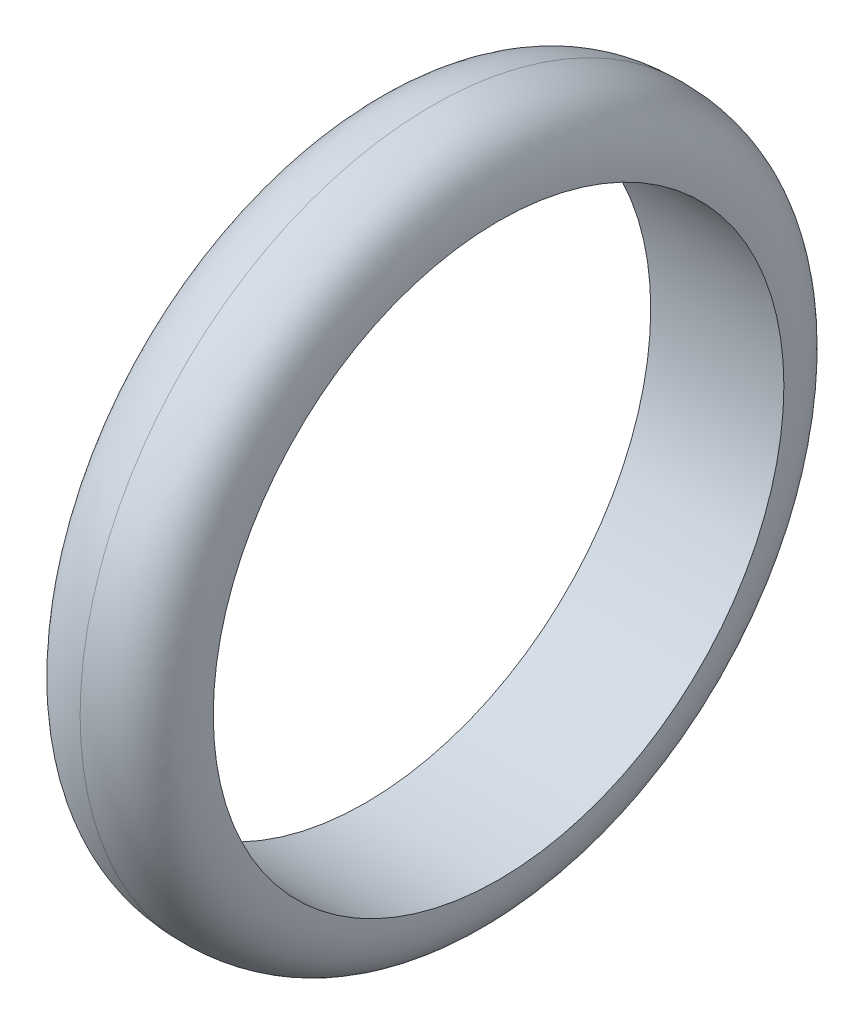
ISO-10303-21;
HEADER;
FILE_DESCRIPTION(('STEP AP214'),'2;1');
FILE_NAME('part.step','',(''),(''),'','','');
FILE_SCHEMA(('AUTOMOTIVE_DESIGN { 1 0 10303 214 1 1 1 1 }'));
ENDSEC;
DATA;
#1=APPLICATION_CONTEXT('core data for automotive mechanical design processes');
#2=APPLICATION_PROTOCOL_DEFINITION('international standard','automotive_design',2000,#1);
#3=PRODUCT_CONTEXT('',#1,'mechanical');
#4=PRODUCT('Part','Part','',(#3));
#5=PRODUCT_RELATED_PRODUCT_CATEGORY('part','',(#4));
#6=PRODUCT_DEFINITION_FORMATION('','',#4);
#7=PRODUCT_DEFINITION_CONTEXT('part definition',#1,'design');
#8=PRODUCT_DEFINITION('design','',#6,#7);
#9=PRODUCT_DEFINITION_SHAPE('','',#8);
#10=(LENGTH_UNIT() NAMED_UNIT(*) SI_UNIT(.MILLI.,.METRE.));
#11=(NAMED_UNIT(*) PLANE_ANGLE_UNIT() SI_UNIT($,.RADIAN.));
#12=(NAMED_UNIT(*) SI_UNIT($,.STERADIAN.) SOLID_ANGLE_UNIT());
#13=UNCERTAINTY_MEASURE_WITH_UNIT(LENGTH_MEASURE(1.E-05),#10,'distance_accuracy_value','');
#14=(GEOMETRIC_REPRESENTATION_CONTEXT(3) GLOBAL_UNCERTAINTY_ASSIGNED_CONTEXT((#13)) GLOBAL_UNIT_ASSIGNED_CONTEXT((#10,
#11,#12)) REPRESENTATION_CONTEXT('',''));
#15=CARTESIAN_POINT('',(0.,0.,0.));
#16=DIRECTION('',(0.,0.,1.));
#17=DIRECTION('',(1.,0.,0.));
#18=AXIS2_PLACEMENT_3D('',#15,#16,#17);
#19=CARTESIAN_POINT('',(0.,46.99,0.));
#20=CARTESIAN_POINT('',(-8.89,46.99,0.));
#21=CARTESIAN_POINT('',(-8.89,38.1,0.));
#22=B_SPLINE_CURVE_WITH_KNOTS('',2,(#19,#20,#21),.UNSPECIFIED.,.F.,.F.,(3,3),(0.,1.),.UNSPECIFIED.);
#23=CARTESIAN_POINT('',(0.,0.,0.));
#24=DIRECTION('',(-1.,0.,0.));
#25=AXIS1_PLACEMENT('',#23,#24);
#26=SURFACE_OF_REVOLUTION('',#22,#25);
#27=CARTESIAN_POINT('',(-8.89,0.,0.));
#28=DIRECTION('',(-1.,0.,0.));
#29=DIRECTION('',(0.,0.,1.));
#30=AXIS2_PLACEMENT_3D('',#27,#28,#29);
#31=CIRCLE('',#30,38.1);
#32=CARTESIAN_POINT('',(-8.89,0.,38.1));
#33=VERTEX_POINT('',#32);
#34=EDGE_CURVE('E10',#33,#33,#31,.T.);
#35=ORIENTED_EDGE('',*,*,#34,.F.);
#36=EDGE_LOOP('',(#35));
#37=FACE_BOUND('',#36,.T.);
#38=CARTESIAN_POINT('',(0.,0.,0.));
#39=DIRECTION('',(-1.,0.,0.));
#40=DIRECTION('',(0.,0.,1.));
#41=AXIS2_PLACEMENT_3D('',#38,#39,#40);
#42=CIRCLE('',#41,46.99);
#43=CARTESIAN_POINT('',(0.,0.,46.99));
#44=VERTEX_POINT('',#43);
#45=EDGE_CURVE('E42',#44,#44,#42,.T.);
#46=ORIENTED_EDGE('',*,*,#45,.T.);
#47=EDGE_LOOP('',(#46));
#48=FACE_BOUND('',#47,.T.);
#49=ADVANCED_FACE('F31',(#37,#48),#26,.T.);
#50=CARTESIAN_POINT('',(0.,0.,0.));
#51=DIRECTION('',(-1.,0.,0.));
#52=DIRECTION('',(0.,0.,1.));
#53=AXIS2_PLACEMENT_3D('',#50,#51,#52);
#54=CYLINDRICAL_SURFACE('',#53,38.1);
#55=CARTESIAN_POINT('',(8.89,0.,0.));
#56=DIRECTION('',(-1.,0.,0.));
#57=DIRECTION('',(0.,0.,1.));
#58=AXIS2_PLACEMENT_3D('',#55,#56,#57);
#59=CIRCLE('',#58,38.1);
#60=CARTESIAN_POINT('',(8.89,0.,38.1));
#61=VERTEX_POINT('',#60);
#62=EDGE_CURVE('E38',#61,#61,#59,.T.);
#63=ORIENTED_EDGE('',*,*,#62,.F.);
#64=EDGE_LOOP('',(#63));
#65=FACE_BOUND('',#64,.T.);
#66=ORIENTED_EDGE('',*,*,#34,.T.);
#67=EDGE_LOOP('',(#66));
#68=FACE_BOUND('',#67,.T.);
#69=ADVANCED_FACE('F60',(#65,#68),#54,.F.);
#70=CARTESIAN_POINT('',(8.89,38.1,0.));
#71=CARTESIAN_POINT('',(8.89,46.99,0.));
#72=CARTESIAN_POINT('',(0.,46.99,0.));
#73=B_SPLINE_CURVE_WITH_KNOTS('',2,(#70,#71,#72),.UNSPECIFIED.,.F.,.F.,(3,3),(0.,1.),.UNSPECIFIED.);
#74=CARTESIAN_POINT('',(0.,0.,0.));
#75=DIRECTION('',(-1.,0.,0.));
#76=AXIS1_PLACEMENT('',#74,#75);
#77=SURFACE_OF_REVOLUTION('',#73,#76);
#78=ORIENTED_EDGE('',*,*,#45,.F.);
#79=EDGE_LOOP('',(#78));
#80=FACE_BOUND('',#79,.T.);
#81=ORIENTED_EDGE('',*,*,#62,.T.);
#82=EDGE_LOOP('',(#81));
#83=FACE_BOUND('',#82,.T.);
#84=ADVANCED_FACE('F58',(#80,#83),#77,.T.);
#85=CLOSED_SHELL('',(#49,#69,#84));
#86=MANIFOLD_SOLID_BREP('B2',#85);
#87=ADVANCED_BREP_SHAPE_REPRESENTATION('',(#18,#86),#14);
#88=SHAPE_DEFINITION_REPRESENTATION(#9,#87);
ENDSEC;
END-ISO-10303-21;
